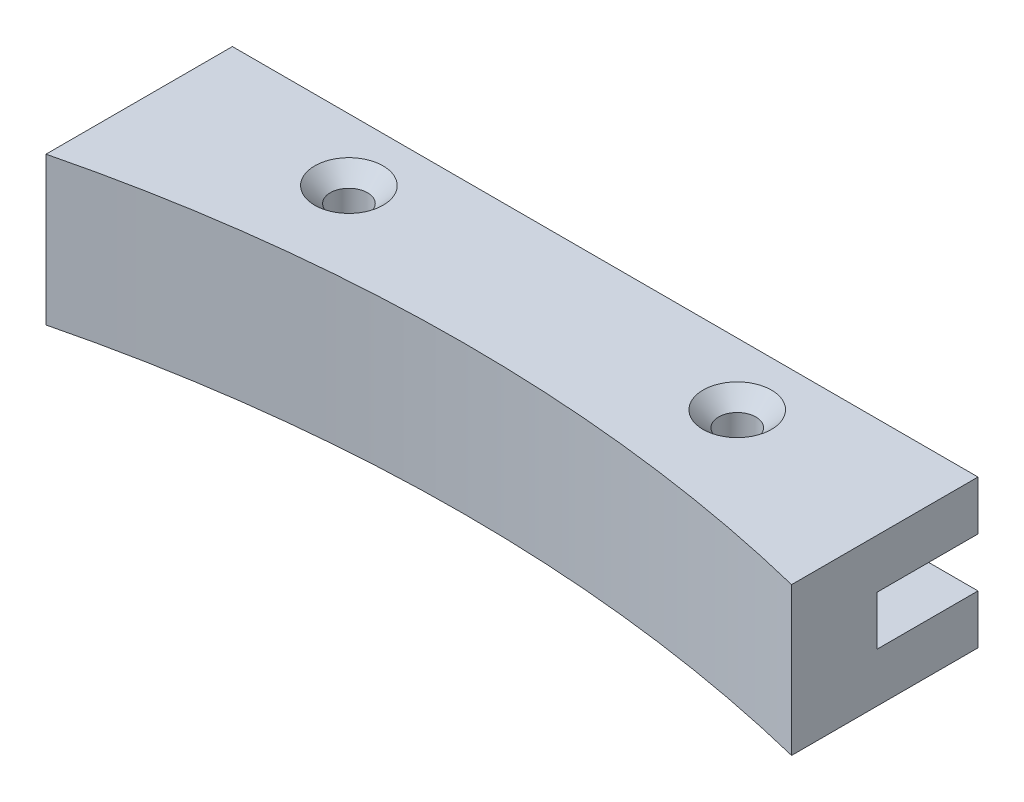
ISO-10303-21;
HEADER;
FILE_DESCRIPTION(('STEP AP214'),'2;1');
FILE_NAME('part.step','',(''),(''),'','','');
FILE_SCHEMA(('AUTOMOTIVE_DESIGN { 1 0 10303 214 1 1 1 1 }'));
ENDSEC;
DATA;
#1=APPLICATION_CONTEXT('core data for automotive mechanical design processes');
#2=APPLICATION_PROTOCOL_DEFINITION('international standard','automotive_design',2000,#1);
#3=PRODUCT_CONTEXT('',#1,'mechanical');
#4=PRODUCT('Part','Part','',(#3));
#5=PRODUCT_RELATED_PRODUCT_CATEGORY('part','',(#4));
#6=PRODUCT_DEFINITION_FORMATION('','',#4);
#7=PRODUCT_DEFINITION_CONTEXT('part definition',#1,'design');
#8=PRODUCT_DEFINITION('design','',#6,#7);
#9=PRODUCT_DEFINITION_SHAPE('','',#8);
#10=(LENGTH_UNIT() NAMED_UNIT(*) SI_UNIT(.MILLI.,.METRE.));
#11=(NAMED_UNIT(*) PLANE_ANGLE_UNIT() SI_UNIT($,.RADIAN.));
#12=(NAMED_UNIT(*) SI_UNIT($,.STERADIAN.) SOLID_ANGLE_UNIT());
#13=UNCERTAINTY_MEASURE_WITH_UNIT(LENGTH_MEASURE(1.E-05),#10,'distance_accuracy_value','');
#14=(GEOMETRIC_REPRESENTATION_CONTEXT(3) GLOBAL_UNCERTAINTY_ASSIGNED_CONTEXT((#13)) GLOBAL_UNIT_ASSIGNED_CONTEXT((#10,
#11,#12)) REPRESENTATION_CONTEXT('',''));
#15=CARTESIAN_POINT('',(0.,0.,0.));
#16=DIRECTION('',(0.,0.,1.));
#17=DIRECTION('',(1.,0.,0.));
#18=AXIS2_PLACEMENT_3D('',#15,#16,#17);
#19=CARTESIAN_POINT('',(0.,4.7625,109.077288796093));
#20=DIRECTION('',(0.,-1.,0.));
#21=DIRECTION('',(0.,0.,-1.));
#22=AXIS2_PLACEMENT_3D('',#19,#20,#21);
#23=PLANE('',#22);
#24=CARTESIAN_POINT('',(12.5,4.7625,3.99999999999999));
#25=DIRECTION('',(0.,1.,0.));
#26=DIRECTION('',(0.,0.,1.));
#27=AXIS2_PLACEMENT_3D('',#24,#25,#26);
#28=CIRCLE('',#27,2.2);
#29=CARTESIAN_POINT('',(12.5,4.7625,6.19999999999999));
#30=VERTEX_POINT('',#29);
#31=EDGE_CURVE('E202',#30,#30,#28,.T.);
#32=ORIENTED_EDGE('',*,*,#31,.F.);
#33=EDGE_LOOP('',(#32));
#34=FACE_BOUND('',#33,.T.);
#35=CARTESIAN_POINT('',(0.,4.7625,109.077288796093));
#36=DIRECTION('',(0.,-1.,0.));
#37=DIRECTION('',(0.,0.,-1.));
#38=AXIS2_PLACEMENT_3D('',#35,#36,#37);
#39=CIRCLE('',#38,100.);
#40=CARTESIAN_POINT('',(-24.,4.7625,12.));
#41=VERTEX_POINT('',#40);
#42=CARTESIAN_POINT('',(24.,4.7625,12.));
#43=VERTEX_POINT('',#42);
#44=EDGE_CURVE('E152',#41,#43,#39,.T.);
#45=ORIENTED_EDGE('',*,*,#44,.T.);
#46=DIRECTION('',(0.,0.,-1.));
#47=VECTOR('',#46,1.);
#48=CARTESIAN_POINT('',(24.,4.7625,0.));
#49=LINE('',#48,#47);
#50=CARTESIAN_POINT('',(24.,4.7625,0.));
#51=VERTEX_POINT('',#50);
#52=EDGE_CURVE('E95',#43,#51,#49,.T.);
#53=ORIENTED_EDGE('',*,*,#52,.T.);
#54=DIRECTION('',(-1.,0.,0.));
#55=VECTOR('',#54,1.);
#56=CARTESIAN_POINT('',(-24.,4.7625,0.));
#57=LINE('',#56,#55);
#58=CARTESIAN_POINT('',(-24.,4.7625,0.));
#59=VERTEX_POINT('',#58);
#60=EDGE_CURVE('E165',#51,#59,#57,.T.);
#61=ORIENTED_EDGE('',*,*,#60,.T.);
#62=DIRECTION('',(0.,0.,1.));
#63=VECTOR('',#62,1.);
#64=CARTESIAN_POINT('',(-24.,4.7625,0.));
#65=LINE('',#64,#63);
#66=EDGE_CURVE('E68',#59,#41,#65,.T.);
#67=ORIENTED_EDGE('',*,*,#66,.T.);
#68=EDGE_LOOP('',(#45,#53,#61,#67));
#69=FACE_BOUND('',#68,.T.);
#70=CARTESIAN_POINT('',(-12.5,4.7625,3.99999999999999));
#71=DIRECTION('',(0.,1.,0.));
#72=DIRECTION('',(0.,0.,1.));
#73=AXIS2_PLACEMENT_3D('',#70,#71,#72);
#74=CIRCLE('',#73,2.2);
#75=CARTESIAN_POINT('',(-12.5,4.7625,6.19999999999999));
#76=VERTEX_POINT('',#75);
#77=EDGE_CURVE('E214',#76,#76,#74,.T.);
#78=ORIENTED_EDGE('',*,*,#77,.F.);
#79=EDGE_LOOP('',(#78));
#80=FACE_BOUND('',#79,.T.);
#81=ADVANCED_FACE('F43',(#34,#69,#80),#23,.F.);
#82=CARTESIAN_POINT('',(-24.,4.7625,0.));
#83=DIRECTION('',(0.,0.,1.));
#84=DIRECTION('',(1.,0.,0.));
#85=AXIS2_PLACEMENT_3D('',#82,#83,#84);
#86=PLANE('',#85);
#87=DIRECTION('',(0.,-1.,0.));
#88=VECTOR('',#87,1.);
#89=CARTESIAN_POINT('',(24.,4.7625,0.));
#90=LINE('',#89,#88);
#91=CARTESIAN_POINT('',(24.,1.5875,0.));
#92=VERTEX_POINT('',#91);
#93=EDGE_CURVE('E52',#51,#92,#90,.T.);
#94=ORIENTED_EDGE('',*,*,#93,.T.);
#95=DIRECTION('',(-1.,0.,0.));
#96=VECTOR('',#95,1.);
#97=CARTESIAN_POINT('',(24.,1.5875,0.));
#98=LINE('',#97,#96);
#99=CARTESIAN_POINT('',(-24.,1.5875,0.));
#100=VERTEX_POINT('',#99);
#101=EDGE_CURVE('E162',#92,#100,#98,.T.);
#102=ORIENTED_EDGE('',*,*,#101,.T.);
#103=DIRECTION('',(0.,-1.,0.));
#104=VECTOR('',#103,1.);
#105=CARTESIAN_POINT('',(-24.,4.7625,0.));
#106=LINE('',#105,#104);
#107=EDGE_CURVE('E140',#59,#100,#106,.T.);
#108=ORIENTED_EDGE('',*,*,#107,.F.);
#109=ORIENTED_EDGE('',*,*,#60,.F.);
#110=EDGE_LOOP('',(#94,#102,#108,#109));
#111=FACE_BOUND('',#110,.T.);
#112=ADVANCED_FACE('F268',(#111),#86,.F.);
#113=CARTESIAN_POINT('',(0.,4.7625,109.077288796093));
#114=DIRECTION('',(0.,-1.,0.));
#115=DIRECTION('',(0.,0.,-1.));
#116=AXIS2_PLACEMENT_3D('',#113,#114,#115);
#117=CYLINDRICAL_SURFACE('',#116,100.);
#118=CARTESIAN_POINT('',(0.,-4.7625,109.077288796093));
#119=DIRECTION('',(0.,-1.,0.));
#120=DIRECTION('',(0.,0.,-1.));
#121=AXIS2_PLACEMENT_3D('',#118,#119,#120);
#122=CIRCLE('',#121,100.);
#123=CARTESIAN_POINT('',(-24.,-4.7625,12.));
#124=VERTEX_POINT('',#123);
#125=CARTESIAN_POINT('',(24.,-4.7625,12.));
#126=VERTEX_POINT('',#125);
#127=EDGE_CURVE('E158',#124,#126,#122,.T.);
#128=ORIENTED_EDGE('',*,*,#127,.T.);
#129=DIRECTION('',(0.,-1.,0.));
#130=VECTOR('',#129,1.);
#131=CARTESIAN_POINT('',(24.,4.7625,12.));
#132=LINE('',#131,#130);
#133=EDGE_CURVE('E11',#43,#126,#132,.T.);
#134=ORIENTED_EDGE('',*,*,#133,.F.);
#135=ORIENTED_EDGE('',*,*,#44,.F.);
#136=DIRECTION('',(0.,-1.,0.));
#137=VECTOR('',#136,1.);
#138=CARTESIAN_POINT('',(-24.,4.7625,12.));
#139=LINE('',#138,#137);
#140=EDGE_CURVE('E147',#41,#124,#139,.T.);
#141=ORIENTED_EDGE('',*,*,#140,.T.);
#142=EDGE_LOOP('',(#128,#134,#135,#141));
#143=FACE_BOUND('',#142,.T.);
#144=ADVANCED_FACE('F45',(#143),#117,.F.);
#145=CARTESIAN_POINT('',(24.,4.7625,0.));
#146=DIRECTION('',(-1.,0.,0.));
#147=DIRECTION('',(0.,0.,1.));
#148=AXIS2_PLACEMENT_3D('',#145,#146,#147);
#149=PLANE('',#148);
#150=DIRECTION('',(0.,1.,0.));
#151=VECTOR('',#150,1.);
#152=CARTESIAN_POINT('',(24.,-1.5875,6.49999999999999));
#153=LINE('',#152,#151);
#154=CARTESIAN_POINT('',(24.,-1.5875,6.49999999999999));
#155=VERTEX_POINT('',#154);
#156=CARTESIAN_POINT('',(24.,1.5875,6.49999999999999));
#157=VERTEX_POINT('',#156);
#158=EDGE_CURVE('E123',#155,#157,#153,.T.);
#159=ORIENTED_EDGE('',*,*,#158,.T.);
#160=DIRECTION('',(0.,0.,-1.));
#161=VECTOR('',#160,1.);
#162=CARTESIAN_POINT('',(24.,1.5875,0.));
#163=LINE('',#162,#161);
#164=EDGE_CURVE('E134',#157,#92,#163,.T.);
#165=ORIENTED_EDGE('',*,*,#164,.T.);
#166=ORIENTED_EDGE('',*,*,#93,.F.);
#167=ORIENTED_EDGE('',*,*,#52,.F.);
#168=ORIENTED_EDGE('',*,*,#133,.T.);
#169=DIRECTION('',(0.,0.,-1.));
#170=VECTOR('',#169,1.);
#171=CARTESIAN_POINT('',(24.,-4.7625,0.));
#172=LINE('',#171,#170);
#173=CARTESIAN_POINT('',(24.,-4.7625,0.));
#174=VERTEX_POINT('',#173);
#175=EDGE_CURVE('E137',#126,#174,#172,.T.);
#176=ORIENTED_EDGE('',*,*,#175,.T.);
#177=CARTESIAN_POINT('',(24.,-1.5875,0.));
#178=VERTEX_POINT('',#177);
#179=EDGE_CURVE('E130',#178,#174,#90,.T.);
#180=ORIENTED_EDGE('',*,*,#179,.F.);
#181=DIRECTION('',(0.,0.,1.));
#182=VECTOR('',#181,1.);
#183=CARTESIAN_POINT('',(24.,-1.5875,0.));
#184=LINE('',#183,#182);
#185=EDGE_CURVE('E116',#178,#155,#184,.T.);
#186=ORIENTED_EDGE('',*,*,#185,.T.);
#187=EDGE_LOOP('',(#159,#165,#166,#167,#168,#176,#180,#186));
#188=FACE_BOUND('',#187,.T.);
#189=ADVANCED_FACE('F136',(#188),#149,.F.);
#190=CARTESIAN_POINT('',(-24.,-1.5875,0.));
#191=VERTEX_POINT('',#190);
#192=CARTESIAN_POINT('',(-24.,-4.7625,0.));
#193=VERTEX_POINT('',#192);
#194=EDGE_CURVE('E132',#191,#193,#106,.T.);
#195=ORIENTED_EDGE('',*,*,#194,.F.);
#196=DIRECTION('',(-1.,0.,0.));
#197=VECTOR('',#196,1.);
#198=CARTESIAN_POINT('',(24.,-1.5875,0.));
#199=LINE('',#198,#197);
#200=EDGE_CURVE('E59',#178,#191,#199,.T.);
#201=ORIENTED_EDGE('',*,*,#200,.F.);
#202=ORIENTED_EDGE('',*,*,#179,.T.);
#203=DIRECTION('',(-1.,0.,0.));
#204=VECTOR('',#203,1.);
#205=CARTESIAN_POINT('',(-24.,-4.7625,0.));
#206=LINE('',#205,#204);
#207=EDGE_CURVE('E153',#174,#193,#206,.T.);
#208=ORIENTED_EDGE('',*,*,#207,.T.);
#209=EDGE_LOOP('',(#195,#201,#202,#208));
#210=FACE_BOUND('',#209,.T.);
#211=ADVANCED_FACE('F128',(#210),#86,.F.);
#212=CARTESIAN_POINT('',(-24.,4.7625,0.));
#213=DIRECTION('',(1.,0.,0.));
#214=DIRECTION('',(0.,0.,-1.));
#215=AXIS2_PLACEMENT_3D('',#212,#213,#214);
#216=PLANE('',#215);
#217=ORIENTED_EDGE('',*,*,#107,.T.);
#218=DIRECTION('',(0.,0.,-1.));
#219=VECTOR('',#218,1.);
#220=CARTESIAN_POINT('',(-24.,1.5875,0.));
#221=LINE('',#220,#219);
#222=CARTESIAN_POINT('',(-24.,1.5875,6.50000000000001));
#223=VERTEX_POINT('',#222);
#224=EDGE_CURVE('E124',#223,#100,#221,.T.);
#225=ORIENTED_EDGE('',*,*,#224,.F.);
#226=DIRECTION('',(0.,1.,0.));
#227=VECTOR('',#226,1.);
#228=CARTESIAN_POINT('',(-24.,-1.5875,6.50000000000001));
#229=LINE('',#228,#227);
#230=CARTESIAN_POINT('',(-24.,-1.5875,6.50000000000001));
#231=VERTEX_POINT('',#230);
#232=EDGE_CURVE('E182',#231,#223,#229,.T.);
#233=ORIENTED_EDGE('',*,*,#232,.F.);
#234=DIRECTION('',(0.,0.,1.));
#235=VECTOR('',#234,1.);
#236=CARTESIAN_POINT('',(-24.,-1.5875,0.));
#237=LINE('',#236,#235);
#238=EDGE_CURVE('E186',#191,#231,#237,.T.);
#239=ORIENTED_EDGE('',*,*,#238,.F.);
#240=ORIENTED_EDGE('',*,*,#194,.T.);
#241=DIRECTION('',(0.,0.,1.));
#242=VECTOR('',#241,1.);
#243=CARTESIAN_POINT('',(-24.,-4.7625,0.));
#244=LINE('',#243,#242);
#245=EDGE_CURVE('E88',#193,#124,#244,.T.);
#246=ORIENTED_EDGE('',*,*,#245,.T.);
#247=ORIENTED_EDGE('',*,*,#140,.F.);
#248=ORIENTED_EDGE('',*,*,#66,.F.);
#249=EDGE_LOOP('',(#217,#225,#233,#239,#240,#246,#247,#248));
#250=FACE_BOUND('',#249,.T.);
#251=ADVANCED_FACE('F256',(#250),#216,.F.);
#252=CARTESIAN_POINT('',(0.,-4.7625,109.077288796093));
#253=DIRECTION('',(0.,-1.,0.));
#254=DIRECTION('',(0.,0.,-1.));
#255=AXIS2_PLACEMENT_3D('',#252,#253,#254);
#256=PLANE('',#255);
#257=CARTESIAN_POINT('',(-12.5,-4.7625,3.99999999999999));
#258=DIRECTION('',(0.,-1.,0.));
#259=DIRECTION('',(0.,0.,-1.));
#260=AXIS2_PLACEMENT_3D('',#257,#258,#259);
#261=CIRCLE('',#260,0.799999999999999);
#262=CARTESIAN_POINT('',(-12.5,-4.7625,3.19999999999999));
#263=VERTEX_POINT('',#262);
#264=EDGE_CURVE('E226',#263,#263,#261,.T.);
#265=ORIENTED_EDGE('',*,*,#264,.F.);
#266=EDGE_LOOP('',(#265));
#267=FACE_BOUND('',#266,.T.);
#268=CARTESIAN_POINT('',(12.5,-4.7625,3.99999999999999));
#269=DIRECTION('',(0.,-1.,0.));
#270=DIRECTION('',(0.,0.,-1.));
#271=AXIS2_PLACEMENT_3D('',#268,#269,#270);
#272=CIRCLE('',#271,0.799999999999999);
#273=CARTESIAN_POINT('',(12.5,-4.7625,3.19999999999999));
#274=VERTEX_POINT('',#273);
#275=EDGE_CURVE('E218',#274,#274,#272,.T.);
#276=ORIENTED_EDGE('',*,*,#275,.F.);
#277=EDGE_LOOP('',(#276));
#278=FACE_BOUND('',#277,.T.);
#279=ORIENTED_EDGE('',*,*,#127,.F.);
#280=ORIENTED_EDGE('',*,*,#245,.F.);
#281=ORIENTED_EDGE('',*,*,#207,.F.);
#282=ORIENTED_EDGE('',*,*,#175,.F.);
#283=EDGE_LOOP('',(#279,#280,#281,#282));
#284=FACE_BOUND('',#283,.T.);
#285=ADVANCED_FACE('F252',(#267,#278,#284),#256,.T.);
#286=CARTESIAN_POINT('',(24.,1.5875,0.));
#287=DIRECTION('',(0.,1.,0.));
#288=DIRECTION('',(0.,0.,1.));
#289=AXIS2_PLACEMENT_3D('',#286,#287,#288);
#290=PLANE('',#289);
#291=CARTESIAN_POINT('',(-12.5,1.5875,3.99999999999999));
#292=DIRECTION('',(0.,1.,0.));
#293=DIRECTION('',(0.,0.,1.));
#294=AXIS2_PLACEMENT_3D('',#291,#292,#293);
#295=CIRCLE('',#294,1.2);
#296=CARTESIAN_POINT('',(-12.5,1.5875,5.19999999999999));
#297=VERTEX_POINT('',#296);
#298=EDGE_CURVE('E206',#297,#297,#295,.T.);
#299=ORIENTED_EDGE('',*,*,#298,.T.);
#300=EDGE_LOOP('',(#299));
#301=FACE_BOUND('',#300,.T.);
#302=CARTESIAN_POINT('',(12.5,1.5875,3.99999999999999));
#303=DIRECTION('',(0.,1.,0.));
#304=DIRECTION('',(0.,0.,1.));
#305=AXIS2_PLACEMENT_3D('',#302,#303,#304);
#306=CIRCLE('',#305,1.2);
#307=CARTESIAN_POINT('',(12.5,1.5875,5.19999999999999));
#308=VERTEX_POINT('',#307);
#309=EDGE_CURVE('E189',#308,#308,#306,.T.);
#310=ORIENTED_EDGE('',*,*,#309,.T.);
#311=EDGE_LOOP('',(#310));
#312=FACE_BOUND('',#311,.T.);
#313=ORIENTED_EDGE('',*,*,#224,.T.);
#314=ORIENTED_EDGE('',*,*,#101,.F.);
#315=ORIENTED_EDGE('',*,*,#164,.F.);
#316=DIRECTION('',(-1.,0.,0.));
#317=VECTOR('',#316,1.);
#318=CARTESIAN_POINT('',(24.,1.5875,6.49999999999999));
#319=LINE('',#318,#317);
#320=EDGE_CURVE('E174',#157,#223,#319,.T.);
#321=ORIENTED_EDGE('',*,*,#320,.T.);
#322=EDGE_LOOP('',(#313,#314,#315,#321));
#323=FACE_BOUND('',#322,.T.);
#324=ADVANCED_FACE('F255',(#301,#312,#323),#290,.F.);
#325=CARTESIAN_POINT('',(24.,-1.5875,6.49999999999999));
#326=DIRECTION('',(0.,0.,1.));
#327=DIRECTION('',(1.,0.,0.));
#328=AXIS2_PLACEMENT_3D('',#325,#326,#327);
#329=PLANE('',#328);
#330=ORIENTED_EDGE('',*,*,#232,.T.);
#331=ORIENTED_EDGE('',*,*,#320,.F.);
#332=ORIENTED_EDGE('',*,*,#158,.F.);
#333=DIRECTION('',(-1.,0.,0.));
#334=VECTOR('',#333,1.);
#335=CARTESIAN_POINT('',(24.,-1.5875,6.49999999999999));
#336=LINE('',#335,#334);
#337=EDGE_CURVE('E118',#155,#231,#336,.T.);
#338=ORIENTED_EDGE('',*,*,#337,.T.);
#339=EDGE_LOOP('',(#330,#331,#332,#338));
#340=FACE_BOUND('',#339,.T.);
#341=ADVANCED_FACE('F241',(#340),#329,.F.);
#342=CARTESIAN_POINT('',(24.,-1.5875,0.));
#343=DIRECTION('',(0.,-1.,0.));
#344=DIRECTION('',(0.,0.,-1.));
#345=AXIS2_PLACEMENT_3D('',#342,#343,#344);
#346=PLANE('',#345);
#347=CARTESIAN_POINT('',(-12.5,-1.5875,3.99999999999999));
#348=DIRECTION('',(0.,1.,0.));
#349=DIRECTION('',(0.,0.,1.));
#350=AXIS2_PLACEMENT_3D('',#347,#348,#349);
#351=CIRCLE('',#350,0.799999999999999);
#352=CARTESIAN_POINT('',(-12.5,-1.5875,4.79999999999999));
#353=VERTEX_POINT('',#352);
#354=EDGE_CURVE('E230',#353,#353,#351,.T.);
#355=ORIENTED_EDGE('',*,*,#354,.F.);
#356=EDGE_LOOP('',(#355));
#357=FACE_BOUND('',#356,.T.);
#358=CARTESIAN_POINT('',(12.5,-1.5875,3.99999999999999));
#359=DIRECTION('',(0.,1.,0.));
#360=DIRECTION('',(0.,0.,1.));
#361=AXIS2_PLACEMENT_3D('',#358,#359,#360);
#362=CIRCLE('',#361,0.799999999999999);
#363=CARTESIAN_POINT('',(12.5,-1.5875,4.79999999999999));
#364=VERTEX_POINT('',#363);
#365=EDGE_CURVE('E222',#364,#364,#362,.T.);
#366=ORIENTED_EDGE('',*,*,#365,.F.);
#367=EDGE_LOOP('',(#366));
#368=FACE_BOUND('',#367,.T.);
#369=ORIENTED_EDGE('',*,*,#238,.T.);
#370=ORIENTED_EDGE('',*,*,#337,.F.);
#371=ORIENTED_EDGE('',*,*,#185,.F.);
#372=ORIENTED_EDGE('',*,*,#200,.T.);
#373=EDGE_LOOP('',(#369,#370,#371,#372));
#374=FACE_BOUND('',#373,.T.);
#375=ADVANCED_FACE('F117',(#357,#368,#374),#346,.F.);
#376=CARTESIAN_POINT('',(12.5,4.7625,3.99999999999999));
#377=DIRECTION('',(0.,1.,0.));
#378=DIRECTION('',(0.,0.,1.));
#379=AXIS2_PLACEMENT_3D('',#376,#377,#378);
#380=CYLINDRICAL_SURFACE('',#379,1.2);
#381=ORIENTED_EDGE('',*,*,#309,.F.);
#382=EDGE_LOOP('',(#381));
#383=FACE_BOUND('',#382,.T.);
#384=CARTESIAN_POINT('',(12.5,3.7625,3.99999999999999));
#385=DIRECTION('',(0.,1.,0.));
#386=DIRECTION('',(0.,0.,1.));
#387=AXIS2_PLACEMENT_3D('',#384,#385,#386);
#388=CIRCLE('',#387,1.2);
#389=CARTESIAN_POINT('',(12.5,3.7625,5.19999999999999));
#390=VERTEX_POINT('',#389);
#391=EDGE_CURVE('E198',#390,#390,#388,.T.);
#392=ORIENTED_EDGE('',*,*,#391,.T.);
#393=EDGE_LOOP('',(#392));
#394=FACE_BOUND('',#393,.T.);
#395=ADVANCED_FACE('F240',(#383,#394),#380,.F.);
#396=CARTESIAN_POINT('',(12.5,4.7625,3.99999999999999));
#397=DIRECTION('',(0.,1.,0.));
#398=DIRECTION('',(0.,0.,1.));
#399=AXIS2_PLACEMENT_3D('',#396,#397,#398);
#400=CONICAL_SURFACE('',#399,2.2,0.785398163397448);
#401=ORIENTED_EDGE('',*,*,#391,.F.);
#402=EDGE_LOOP('',(#401));
#403=FACE_BOUND('',#402,.T.);
#404=ORIENTED_EDGE('',*,*,#31,.T.);
#405=EDGE_LOOP('',(#404));
#406=FACE_BOUND('',#405,.T.);
#407=ADVANCED_FACE('F350',(#403,#406),#400,.F.);
#408=CARTESIAN_POINT('',(-12.5,4.7625,3.99999999999999));
#409=DIRECTION('',(0.,1.,0.));
#410=DIRECTION('',(0.,0.,1.));
#411=AXIS2_PLACEMENT_3D('',#408,#409,#410);
#412=CYLINDRICAL_SURFACE('',#411,1.2);
#413=ORIENTED_EDGE('',*,*,#298,.F.);
#414=EDGE_LOOP('',(#413));
#415=FACE_BOUND('',#414,.T.);
#416=CARTESIAN_POINT('',(-12.5,3.7625,3.99999999999999));
#417=DIRECTION('',(0.,1.,0.));
#418=DIRECTION('',(0.,0.,1.));
#419=AXIS2_PLACEMENT_3D('',#416,#417,#418);
#420=CIRCLE('',#419,1.2);
#421=CARTESIAN_POINT('',(-12.5,3.7625,5.19999999999999));
#422=VERTEX_POINT('',#421);
#423=EDGE_CURVE('E210',#422,#422,#420,.T.);
#424=ORIENTED_EDGE('',*,*,#423,.T.);
#425=EDGE_LOOP('',(#424));
#426=FACE_BOUND('',#425,.T.);
#427=ADVANCED_FACE('F360',(#415,#426),#412,.F.);
#428=CARTESIAN_POINT('',(-12.5,4.7625,3.99999999999999));
#429=DIRECTION('',(0.,1.,0.));
#430=DIRECTION('',(0.,0.,1.));
#431=AXIS2_PLACEMENT_3D('',#428,#429,#430);
#432=CONICAL_SURFACE('',#431,2.2,0.785398163397448);
#433=ORIENTED_EDGE('',*,*,#423,.F.);
#434=EDGE_LOOP('',(#433));
#435=FACE_BOUND('',#434,.T.);
#436=ORIENTED_EDGE('',*,*,#77,.T.);
#437=EDGE_LOOP('',(#436));
#438=FACE_BOUND('',#437,.T.);
#439=ADVANCED_FACE('F248',(#435,#438),#432,.F.);
#440=CARTESIAN_POINT('',(12.5,-1.5875,3.99999999999999));
#441=DIRECTION('',(0.,1.,0.));
#442=DIRECTION('',(0.,0.,1.));
#443=AXIS2_PLACEMENT_3D('',#440,#441,#442);
#444=CYLINDRICAL_SURFACE('',#443,0.799999999999999);
#445=ORIENTED_EDGE('',*,*,#365,.T.);
#446=EDGE_LOOP('',(#445));
#447=FACE_BOUND('',#446,.T.);
#448=ORIENTED_EDGE('',*,*,#275,.T.);
#449=EDGE_LOOP('',(#448));
#450=FACE_BOUND('',#449,.T.);
#451=ADVANCED_FACE('F245',(#447,#450),#444,.F.);
#452=CARTESIAN_POINT('',(-12.5,-1.5875,3.99999999999999));
#453=DIRECTION('',(0.,1.,0.));
#454=DIRECTION('',(0.,0.,1.));
#455=AXIS2_PLACEMENT_3D('',#452,#453,#454);
#456=CYLINDRICAL_SURFACE('',#455,0.799999999999999);
#457=ORIENTED_EDGE('',*,*,#354,.T.);
#458=EDGE_LOOP('',(#457));
#459=FACE_BOUND('',#458,.T.);
#460=ORIENTED_EDGE('',*,*,#264,.T.);
#461=EDGE_LOOP('',(#460));
#462=FACE_BOUND('',#461,.T.);
#463=ADVANCED_FACE('F235',(#459,#462),#456,.F.);
#464=CLOSED_SHELL('',(#81,#112,#144,#189,#211,#251,#285,#324,#341,#375,#395,#407,#427,#439,#451,#463));
#465=MANIFOLD_SOLID_BREP('B2',#464);
#466=ADVANCED_BREP_SHAPE_REPRESENTATION('',(#18,#465),#14);
#467=SHAPE_DEFINITION_REPRESENTATION(#9,#466);
ENDSEC;
END-ISO-10303-21;
